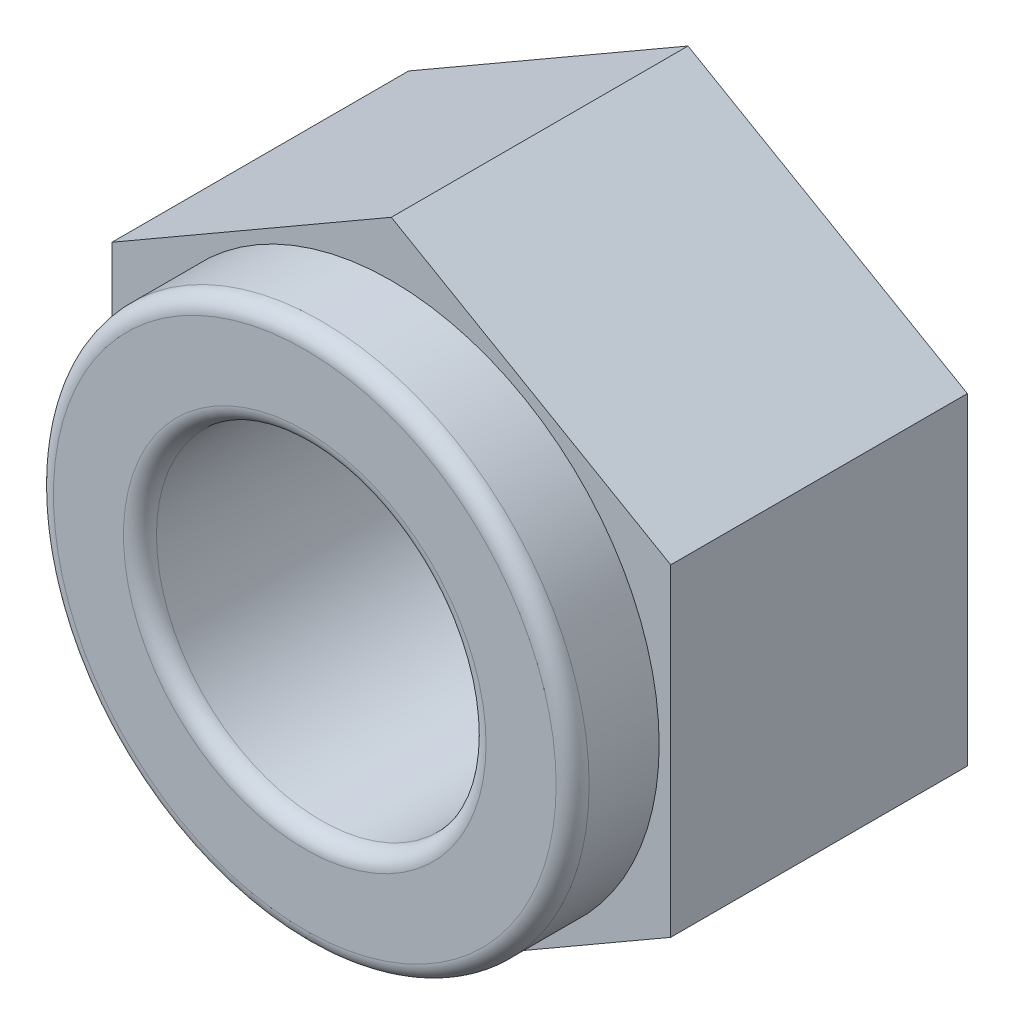
ISO-10303-21;
HEADER;
FILE_DESCRIPTION(('STEP AP214'),'2;1');
FILE_NAME('part.step','',(''),(''),'','','');
FILE_SCHEMA(('AUTOMOTIVE_DESIGN { 1 0 10303 214 1 1 1 1 }'));
ENDSEC;
DATA;
#1=APPLICATION_CONTEXT('core data for automotive mechanical design processes');
#2=APPLICATION_PROTOCOL_DEFINITION('international standard','automotive_design',2000,#1);
#3=PRODUCT_CONTEXT('',#1,'mechanical');
#4=PRODUCT('Part','Part','',(#3));
#5=PRODUCT_RELATED_PRODUCT_CATEGORY('part','',(#4));
#6=PRODUCT_DEFINITION_FORMATION('','',#4);
#7=PRODUCT_DEFINITION_CONTEXT('part definition',#1,'design');
#8=PRODUCT_DEFINITION('design','',#6,#7);
#9=PRODUCT_DEFINITION_SHAPE('','',#8);
#10=(LENGTH_UNIT() NAMED_UNIT(*) SI_UNIT(.MILLI.,.METRE.));
#11=(NAMED_UNIT(*) PLANE_ANGLE_UNIT() SI_UNIT($,.RADIAN.));
#12=(NAMED_UNIT(*) SI_UNIT($,.STERADIAN.) SOLID_ANGLE_UNIT());
#13=UNCERTAINTY_MEASURE_WITH_UNIT(LENGTH_MEASURE(1.E-05),#10,'distance_accuracy_value','');
#14=(GEOMETRIC_REPRESENTATION_CONTEXT(3) GLOBAL_UNCERTAINTY_ASSIGNED_CONTEXT((#13)) GLOBAL_UNIT_ASSIGNED_CONTEXT((#10,
#11,#12)) REPRESENTATION_CONTEXT('',''));
#15=CARTESIAN_POINT('',(0.,0.,0.));
#16=DIRECTION('',(0.,0.,1.));
#17=DIRECTION('',(1.,0.,0.));
#18=AXIS2_PLACEMENT_3D('',#15,#16,#17);
#19=CARTESIAN_POINT('',(0.,0.,3.6));
#20=DIRECTION('',(0.,0.,1.));
#21=DIRECTION('',(1.,0.,0.));
#22=AXIS2_PLACEMENT_3D('',#19,#20,#21);
#23=PLANE('',#22);
#24=DIRECTION('',(0.,-1.,0.));
#25=VECTOR('',#24,1.);
#26=CARTESIAN_POINT('',(-3.39,1.95721741255283,3.6));
#27=LINE('',#26,#25);
#28=CARTESIAN_POINT('',(-3.39,1.95721741255283,3.6));
#29=VERTEX_POINT('',#28);
#30=CARTESIAN_POINT('',(-3.39,-1.95721741255283,3.6));
#31=VERTEX_POINT('',#30);
#32=EDGE_CURVE('E136',#29,#31,#27,.T.);
#33=ORIENTED_EDGE('',*,*,#32,.T.);
#34=DIRECTION('',(0.866025403784439,-0.5,0.));
#35=VECTOR('',#34,1.);
#36=CARTESIAN_POINT('',(-3.39,-1.95721741255283,3.6));
#37=LINE('',#36,#35);
#38=CARTESIAN_POINT('',(0.,-3.91443482510566,3.6));
#39=VERTEX_POINT('',#38);
#40=EDGE_CURVE('E94',#31,#39,#37,.T.);
#41=ORIENTED_EDGE('',*,*,#40,.T.);
#42=DIRECTION('',(0.866025403784439,0.5,0.));
#43=VECTOR('',#42,1.);
#44=CARTESIAN_POINT('',(0.,-3.91443482510566,3.6));
#45=LINE('',#44,#43);
#46=CARTESIAN_POINT('',(3.39,-1.95721741255283,3.6));
#47=VERTEX_POINT('',#46);
#48=EDGE_CURVE('E107',#39,#47,#45,.T.);
#49=ORIENTED_EDGE('',*,*,#48,.T.);
#50=DIRECTION('',(0.,1.,0.));
#51=VECTOR('',#50,1.);
#52=CARTESIAN_POINT('',(3.39,-1.95721741255283,3.6));
#53=LINE('',#52,#51);
#54=CARTESIAN_POINT('',(3.39,1.95721741255283,3.6));
#55=VERTEX_POINT('',#54);
#56=EDGE_CURVE('E101',#47,#55,#53,.T.);
#57=ORIENTED_EDGE('',*,*,#56,.T.);
#58=DIRECTION('',(-0.866025403784439,0.5,0.));
#59=VECTOR('',#58,1.);
#60=CARTESIAN_POINT('',(3.39,1.95721741255283,3.6));
#61=LINE('',#60,#59);
#62=CARTESIAN_POINT('',(0.,3.91443482510567,3.6));
#63=VERTEX_POINT('',#62);
#64=EDGE_CURVE('E105',#55,#63,#61,.T.);
#65=ORIENTED_EDGE('',*,*,#64,.T.);
#66=DIRECTION('',(-0.866025403784438,-0.5,0.));
#67=VECTOR('',#66,1.);
#68=CARTESIAN_POINT('',(0.,3.91443482510567,3.6));
#69=LINE('',#68,#67);
#70=EDGE_CURVE('E56',#63,#29,#69,.T.);
#71=ORIENTED_EDGE('',*,*,#70,.T.);
#72=EDGE_LOOP('',(#33,#41,#49,#57,#65,#71));
#73=FACE_BOUND('',#72,.T.);
#74=CARTESIAN_POINT('',(0.,0.,3.6));
#75=DIRECTION('',(0.,0.,1.));
#76=DIRECTION('',(1.,0.,0.));
#77=AXIS2_PLACEMENT_3D('',#74,#75,#76);
#78=CIRCLE('',#77,3.25);
#79=CARTESIAN_POINT('',(3.25,0.,3.6));
#80=VERTEX_POINT('',#79);
#81=EDGE_CURVE('E129',#80,#80,#78,.T.);
#82=ORIENTED_EDGE('',*,*,#81,.F.);
#83=EDGE_LOOP('',(#82));
#84=FACE_BOUND('',#83,.T.);
#85=ADVANCED_FACE('F39',(#73,#84),#23,.T.);
#86=CARTESIAN_POINT('',(-3.39,1.95721741255283,3.6));
#87=DIRECTION('',(1.,0.,0.));
#88=DIRECTION('',(0.,1.,0.));
#89=AXIS2_PLACEMENT_3D('',#86,#87,#88);
#90=PLANE('',#89);
#91=DIRECTION('',(0.,-1.,0.));
#92=VECTOR('',#91,1.);
#93=CARTESIAN_POINT('',(-3.39,1.95721741255283,0.));
#94=LINE('',#93,#92);
#95=CARTESIAN_POINT('',(-3.39,1.95721741255283,0.));
#96=VERTEX_POINT('',#95);
#97=CARTESIAN_POINT('',(-3.39,-1.95721741255283,0.));
#98=VERTEX_POINT('',#97);
#99=EDGE_CURVE('E125',#96,#98,#94,.T.);
#100=ORIENTED_EDGE('',*,*,#99,.T.);
#101=DIRECTION('',(0.,0.,-1.));
#102=VECTOR('',#101,1.);
#103=CARTESIAN_POINT('',(-3.39,-1.95721741255283,3.6));
#104=LINE('',#103,#102);
#105=EDGE_CURVE('E143',#31,#98,#104,.T.);
#106=ORIENTED_EDGE('',*,*,#105,.F.);
#107=ORIENTED_EDGE('',*,*,#32,.F.);
#108=DIRECTION('',(0.,0.,-1.));
#109=VECTOR('',#108,1.);
#110=CARTESIAN_POINT('',(-3.39,1.95721741255283,3.6));
#111=LINE('',#110,#109);
#112=EDGE_CURVE('E121',#29,#96,#111,.T.);
#113=ORIENTED_EDGE('',*,*,#112,.T.);
#114=EDGE_LOOP('',(#100,#106,#107,#113));
#115=FACE_BOUND('',#114,.T.);
#116=ADVANCED_FACE('F166',(#115),#90,.F.);
#117=CARTESIAN_POINT('',(-3.39,-1.95721741255283,3.6));
#118=DIRECTION('',(0.5,0.866025403784439,0.));
#119=DIRECTION('',(-0.866025403784439,0.5,0.));
#120=AXIS2_PLACEMENT_3D('',#117,#118,#119);
#121=PLANE('',#120);
#122=DIRECTION('',(0.866025403784439,-0.5,0.));
#123=VECTOR('',#122,1.);
#124=CARTESIAN_POINT('',(-3.39,-1.95721741255283,0.));
#125=LINE('',#124,#123);
#126=CARTESIAN_POINT('',(0.,-3.91443482510566,0.));
#127=VERTEX_POINT('',#126);
#128=EDGE_CURVE('E128',#98,#127,#125,.T.);
#129=ORIENTED_EDGE('',*,*,#128,.T.);
#130=DIRECTION('',(0.,0.,-1.));
#131=VECTOR('',#130,1.);
#132=CARTESIAN_POINT('',(0.,-3.91443482510566,3.6));
#133=LINE('',#132,#131);
#134=EDGE_CURVE('E140',#39,#127,#133,.T.);
#135=ORIENTED_EDGE('',*,*,#134,.F.);
#136=ORIENTED_EDGE('',*,*,#40,.F.);
#137=ORIENTED_EDGE('',*,*,#105,.T.);
#138=EDGE_LOOP('',(#129,#135,#136,#137));
#139=FACE_BOUND('',#138,.T.);
#140=ADVANCED_FACE('F171',(#139),#121,.F.);
#141=CARTESIAN_POINT('',(0.,-3.91443482510566,3.6));
#142=DIRECTION('',(-0.5,0.866025403784438,0.));
#143=DIRECTION('',(-0.866025403784439,-0.5,0.));
#144=AXIS2_PLACEMENT_3D('',#141,#142,#143);
#145=PLANE('',#144);
#146=DIRECTION('',(0.866025403784439,0.5,0.));
#147=VECTOR('',#146,1.);
#148=CARTESIAN_POINT('',(0.,-3.91443482510566,0.));
#149=LINE('',#148,#147);
#150=CARTESIAN_POINT('',(3.39,-1.95721741255283,0.));
#151=VERTEX_POINT('',#150);
#152=EDGE_CURVE('E131',#127,#151,#149,.T.);
#153=ORIENTED_EDGE('',*,*,#152,.T.);
#154=DIRECTION('',(0.,0.,-1.));
#155=VECTOR('',#154,1.);
#156=CARTESIAN_POINT('',(3.39,-1.95721741255283,3.6));
#157=LINE('',#156,#155);
#158=EDGE_CURVE('E116',#47,#151,#157,.T.);
#159=ORIENTED_EDGE('',*,*,#158,.F.);
#160=ORIENTED_EDGE('',*,*,#48,.F.);
#161=ORIENTED_EDGE('',*,*,#134,.T.);
#162=EDGE_LOOP('',(#153,#159,#160,#161));
#163=FACE_BOUND('',#162,.T.);
#164=ADVANCED_FACE('F189',(#163),#145,.F.);
#165=CARTESIAN_POINT('',(3.39,-1.95721741255283,3.6));
#166=DIRECTION('',(-1.,0.,0.));
#167=DIRECTION('',(0.,-1.,0.));
#168=AXIS2_PLACEMENT_3D('',#165,#166,#167);
#169=PLANE('',#168);
#170=DIRECTION('',(0.,1.,0.));
#171=VECTOR('',#170,1.);
#172=CARTESIAN_POINT('',(3.39,-1.95721741255283,0.));
#173=LINE('',#172,#171);
#174=CARTESIAN_POINT('',(3.39,1.95721741255283,0.));
#175=VERTEX_POINT('',#174);
#176=EDGE_CURVE('E115',#151,#175,#173,.T.);
#177=ORIENTED_EDGE('',*,*,#176,.T.);
#178=DIRECTION('',(0.,0.,-1.));
#179=VECTOR('',#178,1.);
#180=CARTESIAN_POINT('',(3.39,1.95721741255283,3.6));
#181=LINE('',#180,#179);
#182=EDGE_CURVE('E112',#55,#175,#181,.T.);
#183=ORIENTED_EDGE('',*,*,#182,.F.);
#184=ORIENTED_EDGE('',*,*,#56,.F.);
#185=ORIENTED_EDGE('',*,*,#158,.T.);
#186=EDGE_LOOP('',(#177,#183,#184,#185));
#187=FACE_BOUND('',#186,.T.);
#188=ADVANCED_FACE('F113',(#187),#169,.F.);
#189=CARTESIAN_POINT('',(3.39,1.95721741255283,3.6));
#190=DIRECTION('',(-0.5,-0.866025403784438,0.));
#191=DIRECTION('',(0.866025403784439,-0.5,0.));
#192=AXIS2_PLACEMENT_3D('',#189,#190,#191);
#193=PLANE('',#192);
#194=DIRECTION('',(-0.866025403784439,0.5,0.));
#195=VECTOR('',#194,1.);
#196=CARTESIAN_POINT('',(3.39,1.95721741255283,0.));
#197=LINE('',#196,#195);
#198=CARTESIAN_POINT('',(0.,3.91443482510567,0.));
#199=VERTEX_POINT('',#198);
#200=EDGE_CURVE('E79',#175,#199,#197,.T.);
#201=ORIENTED_EDGE('',*,*,#200,.T.);
#202=DIRECTION('',(0.,0.,-1.));
#203=VECTOR('',#202,1.);
#204=CARTESIAN_POINT('',(0.,3.91443482510567,3.6));
#205=LINE('',#204,#203);
#206=EDGE_CURVE('E117',#63,#199,#205,.T.);
#207=ORIENTED_EDGE('',*,*,#206,.F.);
#208=ORIENTED_EDGE('',*,*,#64,.F.);
#209=ORIENTED_EDGE('',*,*,#182,.T.);
#210=EDGE_LOOP('',(#201,#207,#208,#209));
#211=FACE_BOUND('',#210,.T.);
#212=ADVANCED_FACE('F119',(#211),#193,.F.);
#213=CARTESIAN_POINT('',(0.,3.91443482510567,3.6));
#214=DIRECTION('',(0.5,-0.866025403784439,0.));
#215=DIRECTION('',(0.866025403784439,0.5,0.));
#216=AXIS2_PLACEMENT_3D('',#213,#214,#215);
#217=PLANE('',#216);
#218=DIRECTION('',(-0.866025403784438,-0.5,0.));
#219=VECTOR('',#218,1.);
#220=CARTESIAN_POINT('',(0.,3.91443482510567,0.));
#221=LINE('',#220,#219);
#222=EDGE_CURVE('E85',#199,#96,#221,.T.);
#223=ORIENTED_EDGE('',*,*,#222,.T.);
#224=ORIENTED_EDGE('',*,*,#112,.F.);
#225=ORIENTED_EDGE('',*,*,#70,.F.);
#226=ORIENTED_EDGE('',*,*,#206,.T.);
#227=EDGE_LOOP('',(#223,#224,#225,#226));
#228=FACE_BOUND('',#227,.T.);
#229=ADVANCED_FACE('F181',(#228),#217,.F.);
#230=CARTESIAN_POINT('',(0.,0.,0.));
#231=DIRECTION('',(0.,0.,1.));
#232=DIRECTION('',(1.,0.,0.));
#233=AXIS2_PLACEMENT_3D('',#230,#231,#232);
#234=PLANE('',#233);
#235=CARTESIAN_POINT('',(0.,0.,0.));
#236=DIRECTION('',(0.,0.,1.));
#237=DIRECTION('',(1.,0.,0.));
#238=AXIS2_PLACEMENT_3D('',#235,#236,#237);
#239=CIRCLE('',#238,2.);
#240=CARTESIAN_POINT('',(2.,0.,0.));
#241=VERTEX_POINT('',#240);
#242=EDGE_CURVE('E206',#241,#241,#239,.T.);
#243=ORIENTED_EDGE('',*,*,#242,.T.);
#244=EDGE_LOOP('',(#243));
#245=FACE_BOUND('',#244,.T.);
#246=ORIENTED_EDGE('',*,*,#99,.F.);
#247=ORIENTED_EDGE('',*,*,#222,.F.);
#248=ORIENTED_EDGE('',*,*,#200,.F.);
#249=ORIENTED_EDGE('',*,*,#176,.F.);
#250=ORIENTED_EDGE('',*,*,#152,.F.);
#251=ORIENTED_EDGE('',*,*,#128,.F.);
#252=EDGE_LOOP('',(#246,#247,#248,#249,#250,#251));
#253=FACE_BOUND('',#252,.T.);
#254=ADVANCED_FACE('F178',(#245,#253),#234,.F.);
#255=CARTESIAN_POINT('',(0.,0.,4.65));
#256=DIRECTION('',(0.,0.,1.));
#257=DIRECTION('',(1.,0.,0.));
#258=AXIS2_PLACEMENT_3D('',#255,#256,#257);
#259=PLANE('',#258);
#260=CARTESIAN_POINT('',(0.,0.,4.65));
#261=DIRECTION('',(0.,0.,1.));
#262=DIRECTION('',(1.,0.,0.));
#263=AXIS2_PLACEMENT_3D('',#260,#261,#262);
#264=CIRCLE('',#263,3.05);
#265=CARTESIAN_POINT('',(3.05,0.,4.65));
#266=VERTEX_POINT('',#265);
#267=EDGE_CURVE('E48',#266,#266,#264,.T.);
#268=ORIENTED_EDGE('',*,*,#267,.T.);
#269=EDGE_LOOP('',(#268));
#270=FACE_BOUND('',#269,.T.);
#271=CARTESIAN_POINT('',(0.,0.,4.65));
#272=DIRECTION('',(0.,0.,1.));
#273=DIRECTION('',(1.,0.,0.));
#274=AXIS2_PLACEMENT_3D('',#271,#272,#273);
#275=CIRCLE('',#274,2.2);
#276=CARTESIAN_POINT('',(2.2,0.,4.65));
#277=VERTEX_POINT('',#276);
#278=EDGE_CURVE('E148',#277,#277,#275,.F.);
#279=ORIENTED_EDGE('',*,*,#278,.T.);
#280=EDGE_LOOP('',(#279));
#281=FACE_BOUND('',#280,.T.);
#282=ADVANCED_FACE('F153',(#270,#281),#259,.T.);
#283=CARTESIAN_POINT('',(0.,0.,4.65));
#284=DIRECTION('',(0.,0.,-1.));
#285=DIRECTION('',(-1.,0.,0.));
#286=AXIS2_PLACEMENT_3D('',#283,#284,#285);
#287=CYLINDRICAL_SURFACE('',#286,3.25);
#288=CARTESIAN_POINT('',(0.,0.,4.45));
#289=DIRECTION('',(0.,0.,1.));
#290=DIRECTION('',(1.,0.,0.));
#291=AXIS2_PLACEMENT_3D('',#288,#289,#290);
#292=CIRCLE('',#291,3.25);
#293=CARTESIAN_POINT('',(3.25,0.,4.45));
#294=VERTEX_POINT('',#293);
#295=EDGE_CURVE('E11',#294,#294,#292,.F.);
#296=ORIENTED_EDGE('',*,*,#295,.T.);
#297=EDGE_LOOP('',(#296));
#298=FACE_BOUND('',#297,.T.);
#299=ORIENTED_EDGE('',*,*,#81,.T.);
#300=EDGE_LOOP('',(#299));
#301=FACE_BOUND('',#300,.T.);
#302=ADVANCED_FACE('F176',(#298,#301),#287,.T.);
#303=CARTESIAN_POINT('',(0.,0.,4.65));
#304=DIRECTION('',(0.,0.,-1.));
#305=DIRECTION('',(-1.,0.,0.));
#306=AXIS2_PLACEMENT_3D('',#303,#304,#305);
#307=CYLINDRICAL_SURFACE('',#306,2.);
#308=CARTESIAN_POINT('',(0.,0.,4.45));
#309=DIRECTION('',(0.,0.,1.));
#310=DIRECTION('',(1.,0.,0.));
#311=AXIS2_PLACEMENT_3D('',#308,#309,#310);
#312=CIRCLE('',#311,2.);
#313=CARTESIAN_POINT('',(2.,0.,4.45));
#314=VERTEX_POINT('',#313);
#315=EDGE_CURVE('E145',#314,#314,#312,.T.);
#316=ORIENTED_EDGE('',*,*,#315,.T.);
#317=EDGE_LOOP('',(#316));
#318=FACE_BOUND('',#317,.T.);
#319=ORIENTED_EDGE('',*,*,#242,.F.);
#320=EDGE_LOOP('',(#319));
#321=FACE_BOUND('',#320,.T.);
#322=ADVANCED_FACE('F162',(#318,#321),#307,.F.);
#323=CARTESIAN_POINT('',(0.,0.,4.45));
#324=DIRECTION('',(0.,0.,1.));
#325=DIRECTION('',(1.,0.,0.));
#326=AXIS2_PLACEMENT_3D('',#323,#324,#325);
#327=TOROIDAL_SURFACE('',#326,2.2,0.2);
#328=ORIENTED_EDGE('',*,*,#278,.F.);
#329=EDGE_LOOP('',(#328));
#330=FACE_BOUND('',#329,.T.);
#331=ORIENTED_EDGE('',*,*,#315,.F.);
#332=EDGE_LOOP('',(#331));
#333=FACE_BOUND('',#332,.T.);
#334=ADVANCED_FACE('F157',(#330,#333),#327,.T.);
#335=CARTESIAN_POINT('',(0.,0.,4.45));
#336=DIRECTION('',(0.,0.,1.));
#337=DIRECTION('',(1.,0.,0.));
#338=AXIS2_PLACEMENT_3D('',#335,#336,#337);
#339=TOROIDAL_SURFACE('',#338,3.05,0.2);
#340=ORIENTED_EDGE('',*,*,#295,.F.);
#341=EDGE_LOOP('',(#340));
#342=FACE_BOUND('',#341,.T.);
#343=ORIENTED_EDGE('',*,*,#267,.F.);
#344=EDGE_LOOP('',(#343));
#345=FACE_BOUND('',#344,.T.);
#346=ADVANCED_FACE('F41',(#342,#345),#339,.T.);
#347=CLOSED_SHELL('',(#85,#116,#140,#164,#188,#212,#229,#254,#282,#302,#322,#334,#346));
#348=MANIFOLD_SOLID_BREP('B2',#347);
#349=ADVANCED_BREP_SHAPE_REPRESENTATION('',(#18,#348),#14);
#350=SHAPE_DEFINITION_REPRESENTATION(#9,#349);
ENDSEC;
END-ISO-10303-21;
